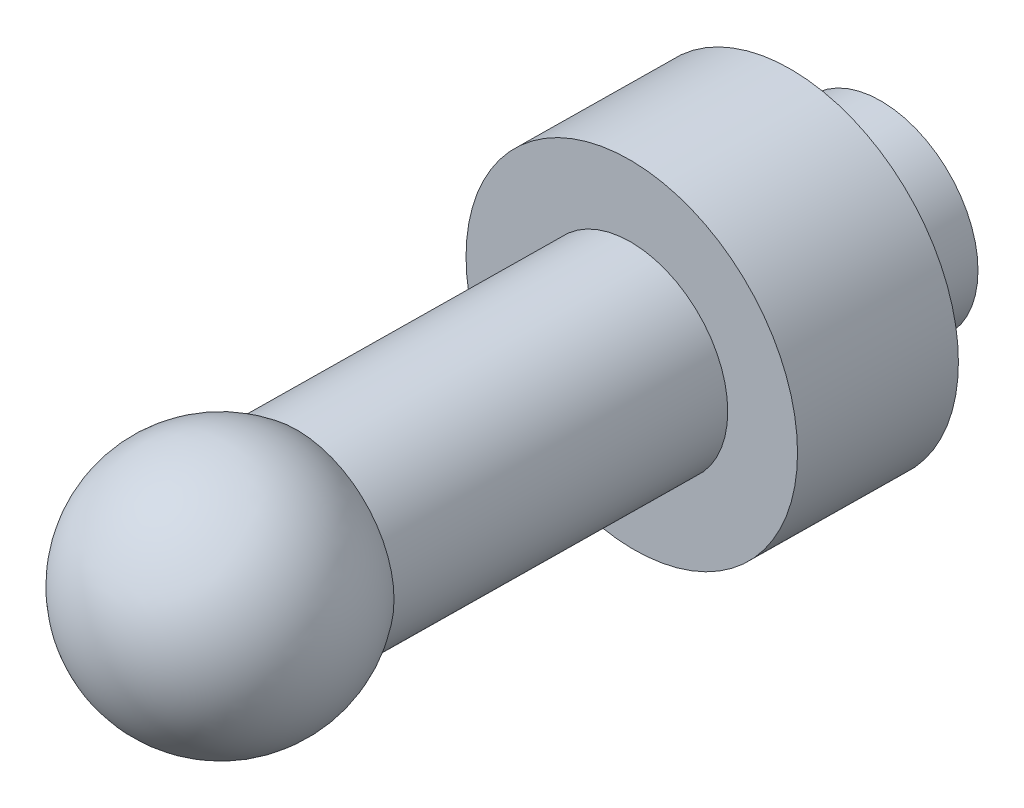
ISO-10303-21;
HEADER;
FILE_DESCRIPTION(('STEP AP214'),'2;1');
FILE_NAME('part.step','',(''),(''),'','','');
FILE_SCHEMA(('AUTOMOTIVE_DESIGN { 1 0 10303 214 1 1 1 1 }'));
ENDSEC;
DATA;
#1=APPLICATION_CONTEXT('core data for automotive mechanical design processes');
#2=APPLICATION_PROTOCOL_DEFINITION('international standard','automotive_design',2000,#1);
#3=PRODUCT_CONTEXT('',#1,'mechanical');
#4=PRODUCT('Part','Part','',(#3));
#5=PRODUCT_RELATED_PRODUCT_CATEGORY('part','',(#4));
#6=PRODUCT_DEFINITION_FORMATION('','',#4);
#7=PRODUCT_DEFINITION_CONTEXT('part definition',#1,'design');
#8=PRODUCT_DEFINITION('design','',#6,#7);
#9=PRODUCT_DEFINITION_SHAPE('','',#8);
#10=(LENGTH_UNIT() NAMED_UNIT(*) SI_UNIT(.MILLI.,.METRE.));
#11=(NAMED_UNIT(*) PLANE_ANGLE_UNIT() SI_UNIT($,.RADIAN.));
#12=(NAMED_UNIT(*) SI_UNIT($,.STERADIAN.) SOLID_ANGLE_UNIT());
#13=UNCERTAINTY_MEASURE_WITH_UNIT(LENGTH_MEASURE(1.E-05),#10,'distance_accuracy_value','');
#14=(GEOMETRIC_REPRESENTATION_CONTEXT(3) GLOBAL_UNCERTAINTY_ASSIGNED_CONTEXT((#13)) GLOBAL_UNIT_ASSIGNED_CONTEXT((#10,
#11,#12)) REPRESENTATION_CONTEXT('',''));
#15=CARTESIAN_POINT('',(0.,0.,0.));
#16=DIRECTION('',(0.,0.,1.));
#17=DIRECTION('',(1.,0.,0.));
#18=AXIS2_PLACEMENT_3D('',#15,#16,#17);
#19=CARTESIAN_POINT('',(0.461014548223053,-109.,-37.9972033916488));
#20=DIRECTION('',(0.,0.,-1.));
#21=DIRECTION('',(1.,0.,0.));
#22=AXIS2_PLACEMENT_3D('',#19,#20,#21);
#23=SPHERICAL_SURFACE('',#22,7.00000000000001);
#24=CARTESIAN_POINT('',(0.461014548223053,-109.,-37.9972033916488));
#25=DIRECTION('',(-0.012131961795362,0.,0.999926405043389));
#26=DIRECTION('',(0.999926405043389,0.,0.012131961795362));
#27=AXIS2_PLACEMENT_3D('',#24,#25,#26);
#28=SPHERICAL_SURFACE('',#27,7.00000000000001);
#29=CARTESIAN_POINT('',(0.513547483785093,-109.,-42.3270117350607));
#30=DIRECTION('',(-0.012131961795362,0.,0.999926405043389));
#31=DIRECTION('',(0.999926405043389,0.,0.012131961795362));
#32=AXIS2_PLACEMENT_3D('',#29,#30,#31);
#33=CIRCLE('',#32,5.50000000000023);
#34=CARTESIAN_POINT('',(6.01314271152396,-109.,-42.2602859451862));
#35=VERTEX_POINT('',#34);
#36=EDGE_CURVE('E68',#35,#35,#33,.F.);
#37=ORIENTED_EDGE('',*,*,#36,.F.);
#38=EDGE_LOOP('',(#37));
#39=FACE_BOUND('',#38,.T.);
#40=ADVANCED_FACE('F57',(#39),#28,.T.);
#41=CARTESIAN_POINT('',(0.740049669515793,-109.,-60.9955107076468));
#42=DIRECTION('',(-0.012131961795362,0.,0.999926405043389));
#43=DIRECTION('',(0.999926405043389,0.,0.012131961795362));
#44=AXIS2_PLACEMENT_3D('',#41,#42,#43);
#45=CYLINDRICAL_SURFACE('',#44,5.50000000000023);
#46=CARTESIAN_POINT('',(0.740049669515794,-109.,-60.9955107076468));
#47=DIRECTION('',(-0.0121319617953462,0.,0.999926405043389));
#48=DIRECTION('',(0.999926405043389,0.,0.0121319617953462));
#49=AXIS2_PLACEMENT_3D('',#46,#47,#48);
#50=CIRCLE('',#49,5.50000000000023);
#51=CARTESIAN_POINT('',(6.23964489725467,-109.,-60.9287849177724));
#52=VERTEX_POINT('',#51);
#53=EDGE_CURVE('E11',#52,#52,#50,.F.);
#54=CARTESIAN_POINT('',(6.23964489725467,-109.,-60.9287849177724));
#55=CARTESIAN_POINT('',(6.23728549948664,-109.,-60.7343213868079));
#56=CARTESIAN_POINT('',(6.23492610171861,-109.,-60.5398578558435));
#57=CARTESIAN_POINT('',(6.23020730618255,-109.,-60.1509307939146));
#58=CARTESIAN_POINT('',(6.22784790841452,-109.,-59.9564672629502));
#59=CARTESIAN_POINT('',(6.22312911287847,-109.,-59.5675402010213));
#60=CARTESIAN_POINT('',(6.22076971511044,-109.,-59.3730766700569));
#61=CARTESIAN_POINT('',(6.21605091957438,-109.,-58.984149608128));
#62=CARTESIAN_POINT('',(6.21369152180636,-109.,-58.7896860771635));
#63=CARTESIAN_POINT('',(6.2089727262703,-109.,-58.4007590152347));
#64=CARTESIAN_POINT('',(6.20661332850227,-109.,-58.2062954842702));
#65=CARTESIAN_POINT('',(6.20189453296622,-109.,-57.8173684223414));
#66=CARTESIAN_POINT('',(6.19953513519819,-109.,-57.6229048913769));
#67=CARTESIAN_POINT('',(6.19481633966213,-109.,-57.233977829448));
#68=CARTESIAN_POINT('',(6.1924569418941,-109.,-57.0395142984836));
#69=CARTESIAN_POINT('',(6.18773814635805,-109.,-56.6505872365547));
#70=CARTESIAN_POINT('',(6.18537874859002,-109.,-56.4561237055903));
#71=CARTESIAN_POINT('',(6.18065995305396,-109.,-56.0671966436614));
#72=CARTESIAN_POINT('',(6.17830055528593,-109.,-55.8727331126969));
#73=CARTESIAN_POINT('',(6.17358175974988,-109.,-55.4838060507681));
#74=CARTESIAN_POINT('',(6.17122236198185,-109.,-55.2893425198036));
#75=CARTESIAN_POINT('',(6.16650356644579,-109.,-54.9004154578748));
#76=CARTESIAN_POINT('',(6.16414416867777,-109.,-54.7059519269103));
#77=CARTESIAN_POINT('',(6.15942537314171,-109.,-54.3170248649814));
#78=CARTESIAN_POINT('',(6.15706597537368,-109.,-54.122561334017));
#79=CARTESIAN_POINT('',(6.15234717983762,-109.,-53.7336342720881));
#80=CARTESIAN_POINT('',(6.1499877820696,-109.,-53.5391707411237));
#81=CARTESIAN_POINT('',(6.14526898653354,-109.,-53.1502436791948));
#82=CARTESIAN_POINT('',(6.14290958876551,-109.,-52.9557801482304));
#83=CARTESIAN_POINT('',(6.13819079322946,-109.,-52.5668530863015));
#84=CARTESIAN_POINT('',(6.13583139546143,-109.,-52.372389555337));
#85=CARTESIAN_POINT('',(6.13111259992537,-109.,-51.9834624934082));
#86=CARTESIAN_POINT('',(6.12875320215734,-109.,-51.7889989624437));
#87=CARTESIAN_POINT('',(6.12403440662129,-109.,-51.4000719005148));
#88=CARTESIAN_POINT('',(6.12167500885326,-109.,-51.2056083695504));
#89=CARTESIAN_POINT('',(6.1169562133172,-109.,-50.8166813076215));
#90=CARTESIAN_POINT('',(6.11459681554917,-109.,-50.6222177766571));
#91=CARTESIAN_POINT('',(6.10987802001312,-109.,-50.2332907147282));
#92=CARTESIAN_POINT('',(6.10751862224509,-109.,-50.0388271837638));
#93=CARTESIAN_POINT('',(6.10279982670903,-109.,-49.6499001218349));
#94=CARTESIAN_POINT('',(6.10044042894101,-109.,-49.4554365908704));
#95=CARTESIAN_POINT('',(6.09572163340495,-109.,-49.0665095289416));
#96=CARTESIAN_POINT('',(6.09336223563692,-109.,-48.8720459979771));
#97=CARTESIAN_POINT('',(6.08864344010087,-109.,-48.4831189360482));
#98=CARTESIAN_POINT('',(6.08628404233284,-109.,-48.2886554050838));
#99=CARTESIAN_POINT('',(6.08156524679678,-109.,-47.8997283431549));
#100=CARTESIAN_POINT('',(6.07920584902875,-109.,-47.7052648121905));
#101=CARTESIAN_POINT('',(6.0744870534927,-109.,-47.3163377502616));
#102=CARTESIAN_POINT('',(6.07212765572467,-109.,-47.1218742192972));
#103=CARTESIAN_POINT('',(6.06740886018861,-109.,-46.7329471573683));
#104=CARTESIAN_POINT('',(6.06504946242058,-109.,-46.5384836264038));
#105=CARTESIAN_POINT('',(6.06033066688453,-109.,-46.149556564475));
#106=CARTESIAN_POINT('',(6.0579712691165,-109.,-45.9550930335105));
#107=CARTESIAN_POINT('',(6.05325247358044,-109.,-45.5661659715816));
#108=CARTESIAN_POINT('',(6.05089307581241,-109.,-45.3717024406172));
#109=CARTESIAN_POINT('',(6.04617428027636,-109.,-44.9827753786883));
#110=CARTESIAN_POINT('',(6.04381488250833,-109.,-44.7883118477239));
#111=CARTESIAN_POINT('',(6.03909608697227,-109.,-44.399384785795));
#112=CARTESIAN_POINT('',(6.03673668920425,-109.,-44.2049212548306));
#113=CARTESIAN_POINT('',(6.03201789366819,-109.,-43.8159941929017));
#114=CARTESIAN_POINT('',(6.02965849590016,-109.,-43.6215306619372));
#115=CARTESIAN_POINT('',(6.02493970036411,-109.,-43.2326036000084));
#116=CARTESIAN_POINT('',(6.02258030259608,-109.,-43.0381400690439));
#117=CARTESIAN_POINT('',(6.01786150706002,-109.,-42.6492130071151));
#118=CARTESIAN_POINT('',(6.01550210929199,-109.,-42.4547494761506));
#119=CARTESIAN_POINT('',(6.01314271152396,-109.,-42.2602859451862));
#120=B_SPLINE_CURVE_WITH_KNOTS('',3,(#54,#55,#56,#57,#58,#59,#60,#61,#62,#63,#64,#65,#66,#67,
#68,#69,#70,#71,#72,#73,#74,#75,#76,#77,#78,#79,#80,#81,#82,#83,#84,#85,#86,#87,#88,#89,#90,#91,
#92,#93,#94,#95,#96,#97,#98,#99,#100,#101,#102,#103,#104,#105,#106,#107,#108,#109,#110,#111,
#112,#113,#114,#115,#116,#117,#118,#119),.UNSPECIFIED.,.F.,.F.,(4,2,2,2,2,2,2,2,2,2,2,2,2,2,2,2,
2,2,2,2,2,2,2,2,2,2,2,2,2,2,2,2,4),(0.,0.583433530658688,1.16686706131738,1.75030059197608,
2.33373412263477,2.91716765329346,3.50060118395216,4.08403471461085,4.66746824526955,
5.25090177592824,5.83433530658694,6.41776883724563,7.00120236790432,7.58463589856302,
8.16806942922171,8.7515029598804,9.33493649053909,9.91837002119779,10.5018035518565,
11.0852370825152,11.6686706131739,12.2521041438326,12.8355376744913,13.41897120515,
14.0024047358086,14.5858382664673,15.169271797126,15.7527053277847,16.3361388584434,
16.9195723891021,17.5030059197608,18.0864394504195,18.6698729810782),.UNSPECIFIED.);
#121=EDGE_CURVE('BSEAM59',#52,#35,#120,.T.);
#122=ORIENTED_EDGE('',*,*,#53,.F.);
#123=ORIENTED_EDGE('',*,*,#36,.T.);
#124=ORIENTED_EDGE('',*,*,#121,.T.);
#125=ORIENTED_EDGE('',*,*,#121,.F.);
#126=EDGE_LOOP('',(#122,#124,#123,#125));
#127=FACE_BOUND('',#126,.T.);
#128=ADVANCED_FACE('F59',(#127),#45,.T.);
#129=CARTESIAN_POINT('',(0.740049669516119,0.,-60.9955107076468));
#130=DIRECTION('',(-0.0121319617953462,0.,0.999926405043389));
#131=DIRECTION('',(0.999926405043389,0.,0.0121319617953462));
#132=AXIS2_PLACEMENT_3D('',#129,#130,#131);
#133=PLANE('',#132);
#134=ORIENTED_EDGE('',*,*,#53,.T.);
#135=EDGE_LOOP('',(#134));
#136=FACE_BOUND('',#135,.T.);
#137=CARTESIAN_POINT('',(0.740049669515874,-109.,-60.9955107076468));
#138=DIRECTION('',(-0.0121319617953462,0.,0.999926405043389));
#139=DIRECTION('',(0.999926405043389,0.,0.0121319617953462));
#140=AXIS2_PLACEMENT_3D('',#137,#138,#139);
#141=CIRCLE('',#140,9.50000000000011);
#142=CARTESIAN_POINT('',(10.2393505174282,-109.,-60.880257070591));
#143=VERTEX_POINT('',#142);
#144=EDGE_CURVE('E76',#143,#143,#141,.F.);
#145=ORIENTED_EDGE('',*,*,#144,.F.);
#146=EDGE_LOOP('',(#145));
#147=FACE_BOUND('',#146,.T.);
#148=ADVANCED_FACE('F92',(#136,#147),#133,.T.);
#149=CARTESIAN_POINT('',(0.849237326349654,0.,-69.9948483530292));
#150=DIRECTION('',(-0.012131961804995,0.,0.999926405043272));
#151=DIRECTION('',(0.999926405043272,0.,0.012131961804995));
#152=AXIS2_PLACEMENT_3D('',#149,#150,#151);
#153=PLANE('',#152);
#154=CARTESIAN_POINT('',(0.849237325674053,-109.,-69.9948483530374));
#155=DIRECTION('',(-0.012131961804995,0.,0.999926405043272));
#156=DIRECTION('',(0.999926405043272,0.,0.012131961804995));
#157=AXIS2_PLACEMENT_3D('',#154,#155,#156);
#158=CIRCLE('',#157,5.50000000000023);
#159=CARTESIAN_POINT('',(6.34883255341228,-109.,-69.92812256311));
#160=VERTEX_POINT('',#159);
#161=EDGE_CURVE('E73',#160,#160,#158,.F.);
#162=ORIENTED_EDGE('',*,*,#161,.F.);
#163=EDGE_LOOP('',(#162));
#164=FACE_BOUND('',#163,.T.);
#165=CARTESIAN_POINT('',(0.849237325674131,-109.,-69.9948483530373));
#166=DIRECTION('',(-0.0121319617953462,0.,0.999926405043389));
#167=DIRECTION('',(0.999926405043389,0.,0.0121319617953462));
#168=AXIS2_PLACEMENT_3D('',#165,#166,#167);
#169=CIRCLE('',#168,9.50000000000011);
#170=CARTESIAN_POINT('',(10.3485381735864,-109.,-69.8795947159815));
#171=VERTEX_POINT('',#170);
#172=EDGE_CURVE('E82',#171,#171,#169,.T.);
#173=ORIENTED_EDGE('',*,*,#172,.F.);
#174=EDGE_LOOP('',(#173));
#175=FACE_BOUND('',#174,.T.);
#176=ADVANCED_FACE('F90',(#164,#175),#153,.F.);
#177=CARTESIAN_POINT('',(0.849237325674131,-109.,-69.9948483530373));
#178=DIRECTION('',(-0.012131961795362,0.,0.999926405043389));
#179=DIRECTION('',(0.999926405043389,0.,0.012131961795362));
#180=AXIS2_PLACEMENT_3D('',#177,#178,#179);
#181=CYLINDRICAL_SURFACE('',#180,9.50000000000011);
#182=ORIENTED_EDGE('',*,*,#172,.T.);
#183=EDGE_LOOP('',(#182));
#184=FACE_BOUND('',#183,.T.);
#185=ORIENTED_EDGE('',*,*,#144,.T.);
#186=EDGE_LOOP('',(#185));
#187=FACE_BOUND('',#186,.T.);
#188=ADVANCED_FACE('F88',(#184,#187),#181,.T.);
#189=CARTESIAN_POINT('',(0.909897134650861,-109.,-74.9944803782543));
#190=DIRECTION('',(0.0121319617953305,0.,-0.999926405043389));
#191=DIRECTION('',(-0.99992640504339,0.,-0.0121319617953305));
#192=AXIS2_PLACEMENT_3D('',#189,#190,#191);
#193=PLANE('',#192);
#194=CARTESIAN_POINT('',(0.909897134650861,-109.,-74.9944803782543));
#195=DIRECTION('',(0.0121319617953305,0.,-0.999926405043389));
#196=DIRECTION('',(-0.99992640504339,0.,-0.0121319617953305));
#197=AXIS2_PLACEMENT_3D('',#194,#195,#196);
#198=CIRCLE('',#197,5.50000000000023);
#199=CARTESIAN_POINT('',(-4.58969809308801,-109.,-75.0612061681286));
#200=VERTEX_POINT('',#199);
#201=EDGE_CURVE('E64',#200,#200,#198,.T.);
#202=ORIENTED_EDGE('',*,*,#201,.T.);
#203=EDGE_LOOP('',(#202));
#204=FACE_BOUND('',#203,.T.);
#205=ADVANCED_FACE('F99',(#204),#193,.T.);
#206=ORIENTED_EDGE('',*,*,#201,.F.);
#207=EDGE_LOOP('',(#206));
#208=FACE_BOUND('',#207,.T.);
#209=ORIENTED_EDGE('',*,*,#161,.T.);
#210=EDGE_LOOP('',(#209));
#211=FACE_BOUND('',#210,.T.);
#212=ADVANCED_FACE('F110',(#208,#211),#45,.T.);
#213=CLOSED_SHELL('',(#40,#128,#148,#176,#188,#205,#212));
#214=MANIFOLD_SOLID_BREP('B2',#213);
#215=ADVANCED_BREP_SHAPE_REPRESENTATION('',(#18,#214),#14);
#216=SHAPE_DEFINITION_REPRESENTATION(#9,#215);
ENDSEC;
END-ISO-10303-21;
